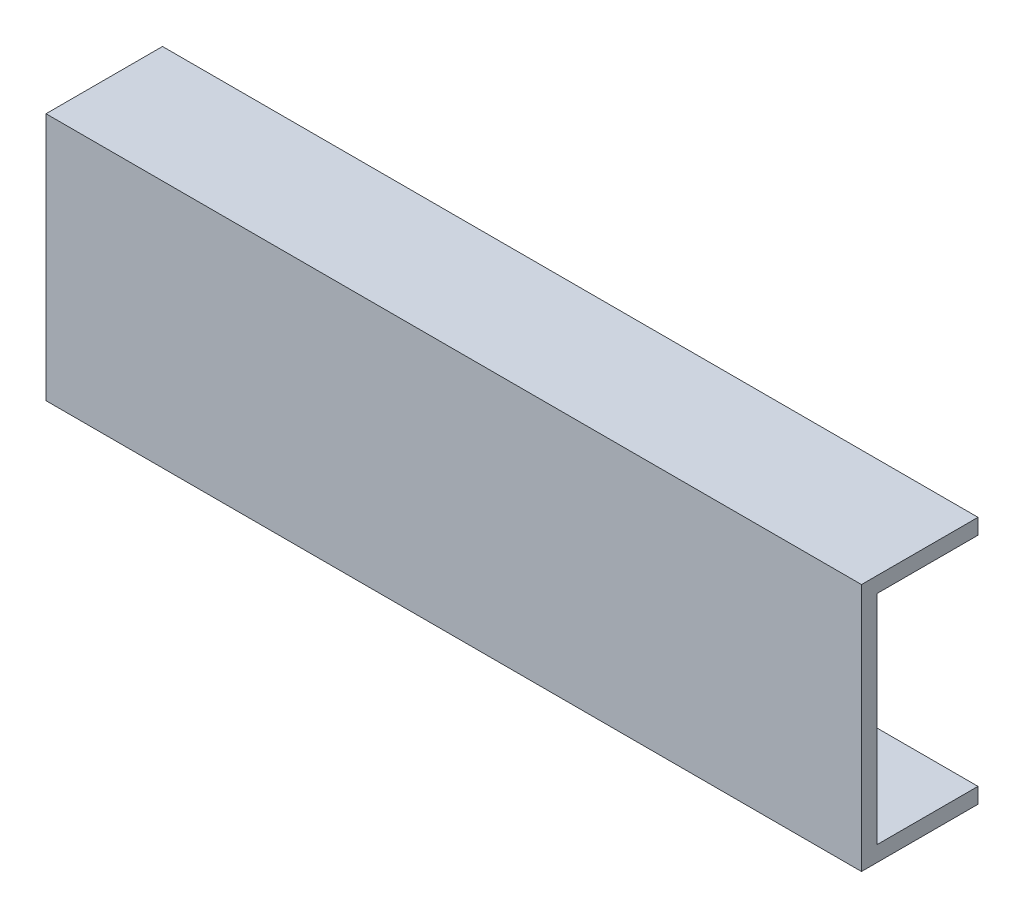
ISO-10303-21;
HEADER;
FILE_DESCRIPTION(('STEP AP214'),'2;1');
FILE_NAME('part.step','',(''),(''),'','','');
FILE_SCHEMA(('AUTOMOTIVE_DESIGN { 1 0 10303 214 1 1 1 1 }'));
ENDSEC;
DATA;
#1=APPLICATION_CONTEXT('core data for automotive mechanical design processes');
#2=APPLICATION_PROTOCOL_DEFINITION('international standard','automotive_design',2000,#1);
#3=PRODUCT_CONTEXT('',#1,'mechanical');
#4=PRODUCT('Part','Part','',(#3));
#5=PRODUCT_RELATED_PRODUCT_CATEGORY('part','',(#4));
#6=PRODUCT_DEFINITION_FORMATION('','',#4);
#7=PRODUCT_DEFINITION_CONTEXT('part definition',#1,'design');
#8=PRODUCT_DEFINITION('design','',#6,#7);
#9=PRODUCT_DEFINITION_SHAPE('','',#8);
#10=(LENGTH_UNIT() NAMED_UNIT(*) SI_UNIT(.MILLI.,.METRE.));
#11=(NAMED_UNIT(*) PLANE_ANGLE_UNIT() SI_UNIT($,.RADIAN.));
#12=(NAMED_UNIT(*) SI_UNIT($,.STERADIAN.) SOLID_ANGLE_UNIT());
#13=UNCERTAINTY_MEASURE_WITH_UNIT(LENGTH_MEASURE(1.E-05),#10,'distance_accuracy_value','');
#14=(GEOMETRIC_REPRESENTATION_CONTEXT(3) GLOBAL_UNCERTAINTY_ASSIGNED_CONTEXT((#13)) GLOBAL_UNIT_ASSIGNED_CONTEXT((#10,
#11,#12)) REPRESENTATION_CONTEXT('',''));
#15=CARTESIAN_POINT('',(0.,0.,0.));
#16=DIRECTION('',(0.,0.,1.));
#17=DIRECTION('',(1.,0.,0.));
#18=AXIS2_PLACEMENT_3D('',#15,#16,#17);
#19=CARTESIAN_POINT('',(0.,0.,0.));
#20=DIRECTION('',(0.,0.,1.));
#21=DIRECTION('',(1.,0.,0.));
#22=AXIS2_PLACEMENT_3D('',#19,#20,#21);
#23=PLANE('',#22);
#24=DIRECTION('',(0.,-1.,0.));
#25=VECTOR('',#24,1.);
#26=CARTESIAN_POINT('',(-105.,0.,0.));
#27=LINE('',#26,#25);
#28=CARTESIAN_POINT('',(-105.,2.,0.));
#29=VERTEX_POINT('',#28);
#30=CARTESIAN_POINT('',(-105.,0.,0.));
#31=VERTEX_POINT('',#30);
#32=EDGE_CURVE('E148',#29,#31,#27,.T.);
#33=ORIENTED_EDGE('',*,*,#32,.F.);
#34=DIRECTION('',(-1.,0.,0.));
#35=VECTOR('',#34,1.);
#36=CARTESIAN_POINT('',(-105.,2.,0.));
#37=LINE('',#36,#35);
#38=CARTESIAN_POINT('',(0.,1.99999999999999,0.));
#39=VERTEX_POINT('',#38);
#40=EDGE_CURVE('E122',#39,#29,#37,.T.);
#41=ORIENTED_EDGE('',*,*,#40,.F.);
#42=DIRECTION('',(0.,1.,0.));
#43=VECTOR('',#42,1.);
#44=CARTESIAN_POINT('',(0.,0.,0.));
#45=LINE('',#44,#43);
#46=CARTESIAN_POINT('',(0.,0.,0.));
#47=VERTEX_POINT('',#46);
#48=EDGE_CURVE('E142',#47,#39,#45,.T.);
#49=ORIENTED_EDGE('',*,*,#48,.F.);
#50=DIRECTION('',(1.,0.,0.));
#51=VECTOR('',#50,1.);
#52=CARTESIAN_POINT('',(0.,0.,0.));
#53=LINE('',#52,#51);
#54=EDGE_CURVE('E78',#31,#47,#53,.T.);
#55=ORIENTED_EDGE('',*,*,#54,.F.);
#56=EDGE_LOOP('',(#33,#41,#49,#55));
#57=FACE_BOUND('',#56,.T.);
#58=ADVANCED_FACE('F33',(#57),#23,.F.);
#59=CARTESIAN_POINT('',(0.,0.,15.));
#60=DIRECTION('',(-1.,0.,0.));
#61=DIRECTION('',(0.,0.,1.));
#62=AXIS2_PLACEMENT_3D('',#59,#60,#61);
#63=PLANE('',#62);
#64=ORIENTED_EDGE('',*,*,#48,.T.);
#65=DIRECTION('',(0.,0.,-1.));
#66=VECTOR('',#65,1.);
#67=CARTESIAN_POINT('',(0.,1.99999999999999,13.));
#68=LINE('',#67,#66);
#69=CARTESIAN_POINT('',(0.,1.99999999999999,13.));
#70=VERTEX_POINT('',#69);
#71=EDGE_CURVE('E130',#70,#39,#68,.T.);
#72=ORIENTED_EDGE('',*,*,#71,.F.);
#73=DIRECTION('',(0.,-1.,0.));
#74=VECTOR('',#73,1.);
#75=CARTESIAN_POINT('',(0.,1.99999999999999,13.));
#76=LINE('',#75,#74);
#77=CARTESIAN_POINT('',(0.,30.,13.));
#78=VERTEX_POINT('',#77);
#79=EDGE_CURVE('E112',#78,#70,#76,.T.);
#80=ORIENTED_EDGE('',*,*,#79,.F.);
#81=DIRECTION('',(0.,0.,-1.));
#82=VECTOR('',#81,1.);
#83=CARTESIAN_POINT('',(0.,30.,13.));
#84=LINE('',#83,#82);
#85=CARTESIAN_POINT('',(0.,30.,0.));
#86=VERTEX_POINT('',#85);
#87=EDGE_CURVE('E109',#78,#86,#84,.T.);
#88=ORIENTED_EDGE('',*,*,#87,.T.);
#89=CARTESIAN_POINT('',(0.,32.,0.));
#90=VERTEX_POINT('',#89);
#91=EDGE_CURVE('E146',#86,#90,#45,.T.);
#92=ORIENTED_EDGE('',*,*,#91,.T.);
#93=DIRECTION('',(0.,0.,-1.));
#94=VECTOR('',#93,1.);
#95=CARTESIAN_POINT('',(0.,32.,15.));
#96=LINE('',#95,#94);
#97=CARTESIAN_POINT('',(0.,32.,15.));
#98=VERTEX_POINT('',#97);
#99=EDGE_CURVE('E11',#98,#90,#96,.T.);
#100=ORIENTED_EDGE('',*,*,#99,.F.);
#101=DIRECTION('',(0.,1.,0.));
#102=VECTOR('',#101,1.);
#103=CARTESIAN_POINT('',(0.,0.,15.));
#104=LINE('',#103,#102);
#105=CARTESIAN_POINT('',(0.,0.,15.));
#106=VERTEX_POINT('',#105);
#107=EDGE_CURVE('E135',#106,#98,#104,.T.);
#108=ORIENTED_EDGE('',*,*,#107,.F.);
#109=DIRECTION('',(0.,0.,-1.));
#110=VECTOR('',#109,1.);
#111=CARTESIAN_POINT('',(0.,0.,15.));
#112=LINE('',#111,#110);
#113=EDGE_CURVE('E141',#106,#47,#112,.T.);
#114=ORIENTED_EDGE('',*,*,#113,.T.);
#115=EDGE_LOOP('',(#64,#72,#80,#88,#92,#100,#108,#114));
#116=FACE_BOUND('',#115,.T.);
#117=ADVANCED_FACE('F35',(#116),#63,.F.);
#118=CARTESIAN_POINT('',(0.,32.,15.));
#119=DIRECTION('',(0.,-1.,0.));
#120=DIRECTION('',(1.,0.,0.));
#121=AXIS2_PLACEMENT_3D('',#118,#119,#120);
#122=PLANE('',#121);
#123=DIRECTION('',(-1.,0.,0.));
#124=VECTOR('',#123,1.);
#125=CARTESIAN_POINT('',(0.,32.,0.));
#126=LINE('',#125,#124);
#127=CARTESIAN_POINT('',(-105.,32.,0.));
#128=VERTEX_POINT('',#127);
#129=EDGE_CURVE('E145',#90,#128,#126,.T.);
#130=ORIENTED_EDGE('',*,*,#129,.T.);
#131=DIRECTION('',(0.,0.,-1.));
#132=VECTOR('',#131,1.);
#133=CARTESIAN_POINT('',(-105.,32.,15.));
#134=LINE('',#133,#132);
#135=CARTESIAN_POINT('',(-105.,32.,15.));
#136=VERTEX_POINT('',#135);
#137=EDGE_CURVE('E41',#136,#128,#134,.T.);
#138=ORIENTED_EDGE('',*,*,#137,.F.);
#139=DIRECTION('',(-1.,0.,0.));
#140=VECTOR('',#139,1.);
#141=CARTESIAN_POINT('',(0.,32.,15.));
#142=LINE('',#141,#140);
#143=EDGE_CURVE('E85',#98,#136,#142,.T.);
#144=ORIENTED_EDGE('',*,*,#143,.F.);
#145=ORIENTED_EDGE('',*,*,#99,.T.);
#146=EDGE_LOOP('',(#130,#138,#144,#145));
#147=FACE_BOUND('',#146,.T.);
#148=ADVANCED_FACE('F184',(#147),#122,.F.);
#149=CARTESIAN_POINT('',(-105.,0.,15.));
#150=DIRECTION('',(1.,0.,0.));
#151=DIRECTION('',(0.,0.,-1.));
#152=AXIS2_PLACEMENT_3D('',#149,#150,#151);
#153=PLANE('',#152);
#154=DIRECTION('',(0.,1.,0.));
#155=VECTOR('',#154,1.);
#156=CARTESIAN_POINT('',(-105.,2.,13.));
#157=LINE('',#156,#155);
#158=CARTESIAN_POINT('',(-105.,2.,13.));
#159=VERTEX_POINT('',#158);
#160=CARTESIAN_POINT('',(-105.,30.,13.));
#161=VERTEX_POINT('',#160);
#162=EDGE_CURVE('E113',#159,#161,#157,.T.);
#163=ORIENTED_EDGE('',*,*,#162,.F.);
#164=DIRECTION('',(0.,0.,-1.));
#165=VECTOR('',#164,1.);
#166=CARTESIAN_POINT('',(-105.,2.,13.));
#167=LINE('',#166,#165);
#168=EDGE_CURVE('E164',#159,#29,#167,.T.);
#169=ORIENTED_EDGE('',*,*,#168,.T.);
#170=ORIENTED_EDGE('',*,*,#32,.T.);
#171=DIRECTION('',(0.,0.,-1.));
#172=VECTOR('',#171,1.);
#173=CARTESIAN_POINT('',(-105.,0.,15.));
#174=LINE('',#173,#172);
#175=CARTESIAN_POINT('',(-105.,0.,15.));
#176=VERTEX_POINT('',#175);
#177=EDGE_CURVE('E152',#176,#31,#174,.T.);
#178=ORIENTED_EDGE('',*,*,#177,.F.);
#179=DIRECTION('',(0.,-1.,0.));
#180=VECTOR('',#179,1.);
#181=CARTESIAN_POINT('',(-105.,0.,15.));
#182=LINE('',#181,#180);
#183=EDGE_CURVE('E138',#136,#176,#182,.T.);
#184=ORIENTED_EDGE('',*,*,#183,.F.);
#185=ORIENTED_EDGE('',*,*,#137,.T.);
#186=CARTESIAN_POINT('',(-105.,30.,0.));
#187=VERTEX_POINT('',#186);
#188=EDGE_CURVE('E128',#128,#187,#27,.T.);
#189=ORIENTED_EDGE('',*,*,#188,.T.);
#190=DIRECTION('',(0.,0.,-1.));
#191=VECTOR('',#190,1.);
#192=CARTESIAN_POINT('',(-105.,30.,13.));
#193=LINE('',#192,#191);
#194=EDGE_CURVE('E48',#161,#187,#193,.T.);
#195=ORIENTED_EDGE('',*,*,#194,.F.);
#196=EDGE_LOOP('',(#163,#169,#170,#178,#184,#185,#189,#195));
#197=FACE_BOUND('',#196,.T.);
#198=ADVANCED_FACE('F125',(#197),#153,.F.);
#199=CARTESIAN_POINT('',(0.,0.,15.));
#200=DIRECTION('',(0.,1.,0.));
#201=DIRECTION('',(0.,0.,1.));
#202=AXIS2_PLACEMENT_3D('',#199,#200,#201);
#203=PLANE('',#202);
#204=ORIENTED_EDGE('',*,*,#54,.T.);
#205=ORIENTED_EDGE('',*,*,#113,.F.);
#206=DIRECTION('',(1.,0.,0.));
#207=VECTOR('',#206,1.);
#208=CARTESIAN_POINT('',(0.,0.,15.));
#209=LINE('',#208,#207);
#210=EDGE_CURVE('E57',#176,#106,#209,.T.);
#211=ORIENTED_EDGE('',*,*,#210,.F.);
#212=ORIENTED_EDGE('',*,*,#177,.T.);
#213=EDGE_LOOP('',(#204,#205,#211,#212));
#214=FACE_BOUND('',#213,.T.);
#215=ADVANCED_FACE('F175',(#214),#203,.F.);
#216=CARTESIAN_POINT('',(0.,0.,15.));
#217=DIRECTION('',(0.,0.,1.));
#218=DIRECTION('',(1.,0.,0.));
#219=AXIS2_PLACEMENT_3D('',#216,#217,#218);
#220=PLANE('',#219);
#221=ORIENTED_EDGE('',*,*,#107,.T.);
#222=ORIENTED_EDGE('',*,*,#143,.T.);
#223=ORIENTED_EDGE('',*,*,#183,.T.);
#224=ORIENTED_EDGE('',*,*,#210,.T.);
#225=EDGE_LOOP('',(#221,#222,#223,#224));
#226=FACE_BOUND('',#225,.T.);
#227=ADVANCED_FACE('F177',(#226),#220,.T.);
#228=ORIENTED_EDGE('',*,*,#91,.F.);
#229=DIRECTION('',(1.,0.,0.));
#230=VECTOR('',#229,1.);
#231=CARTESIAN_POINT('',(-105.,30.,0.));
#232=LINE('',#231,#230);
#233=EDGE_CURVE('E159',#187,#86,#232,.T.);
#234=ORIENTED_EDGE('',*,*,#233,.F.);
#235=ORIENTED_EDGE('',*,*,#188,.F.);
#236=ORIENTED_EDGE('',*,*,#129,.F.);
#237=EDGE_LOOP('',(#228,#234,#235,#236));
#238=FACE_BOUND('',#237,.T.);
#239=ADVANCED_FACE('F158',(#238),#23,.F.);
#240=CARTESIAN_POINT('',(-105.,2.,13.));
#241=DIRECTION('',(0.,-1.,0.));
#242=DIRECTION('',(1.,0.,0.));
#243=AXIS2_PLACEMENT_3D('',#240,#241,#242);
#244=PLANE('',#243);
#245=ORIENTED_EDGE('',*,*,#40,.T.);
#246=ORIENTED_EDGE('',*,*,#168,.F.);
#247=DIRECTION('',(-1.,0.,0.));
#248=VECTOR('',#247,1.);
#249=CARTESIAN_POINT('',(-105.,2.,13.));
#250=LINE('',#249,#248);
#251=EDGE_CURVE('E119',#70,#159,#250,.T.);
#252=ORIENTED_EDGE('',*,*,#251,.F.);
#253=ORIENTED_EDGE('',*,*,#71,.T.);
#254=EDGE_LOOP('',(#245,#246,#252,#253));
#255=FACE_BOUND('',#254,.T.);
#256=ADVANCED_FACE('F168',(#255),#244,.F.);
#257=CARTESIAN_POINT('',(-105.,30.,13.));
#258=DIRECTION('',(0.,1.,0.));
#259=DIRECTION('',(-1.,0.,0.));
#260=AXIS2_PLACEMENT_3D('',#257,#258,#259);
#261=PLANE('',#260);
#262=ORIENTED_EDGE('',*,*,#233,.T.);
#263=ORIENTED_EDGE('',*,*,#87,.F.);
#264=DIRECTION('',(1.,0.,0.));
#265=VECTOR('',#264,1.);
#266=CARTESIAN_POINT('',(-105.,30.,13.));
#267=LINE('',#266,#265);
#268=EDGE_CURVE('E105',#161,#78,#267,.T.);
#269=ORIENTED_EDGE('',*,*,#268,.F.);
#270=ORIENTED_EDGE('',*,*,#194,.T.);
#271=EDGE_LOOP('',(#262,#263,#269,#270));
#272=FACE_BOUND('',#271,.T.);
#273=ADVANCED_FACE('F107',(#272),#261,.F.);
#274=CARTESIAN_POINT('',(0.,0.,13.));
#275=DIRECTION('',(0.,0.,-1.));
#276=DIRECTION('',(-1.,0.,0.));
#277=AXIS2_PLACEMENT_3D('',#274,#275,#276);
#278=PLANE('',#277);
#279=ORIENTED_EDGE('',*,*,#162,.T.);
#280=ORIENTED_EDGE('',*,*,#268,.T.);
#281=ORIENTED_EDGE('',*,*,#79,.T.);
#282=ORIENTED_EDGE('',*,*,#251,.T.);
#283=EDGE_LOOP('',(#279,#280,#281,#282));
#284=FACE_BOUND('',#283,.T.);
#285=ADVANCED_FACE('F117',(#284),#278,.T.);
#286=CLOSED_SHELL('',(#58,#117,#148,#198,#215,#227,#239,#256,#273,#285));
#287=MANIFOLD_SOLID_BREP('B2',#286);
#288=ADVANCED_BREP_SHAPE_REPRESENTATION('',(#18,#287),#14);
#289=SHAPE_DEFINITION_REPRESENTATION(#9,#288);
ENDSEC;
END-ISO-10303-21;
